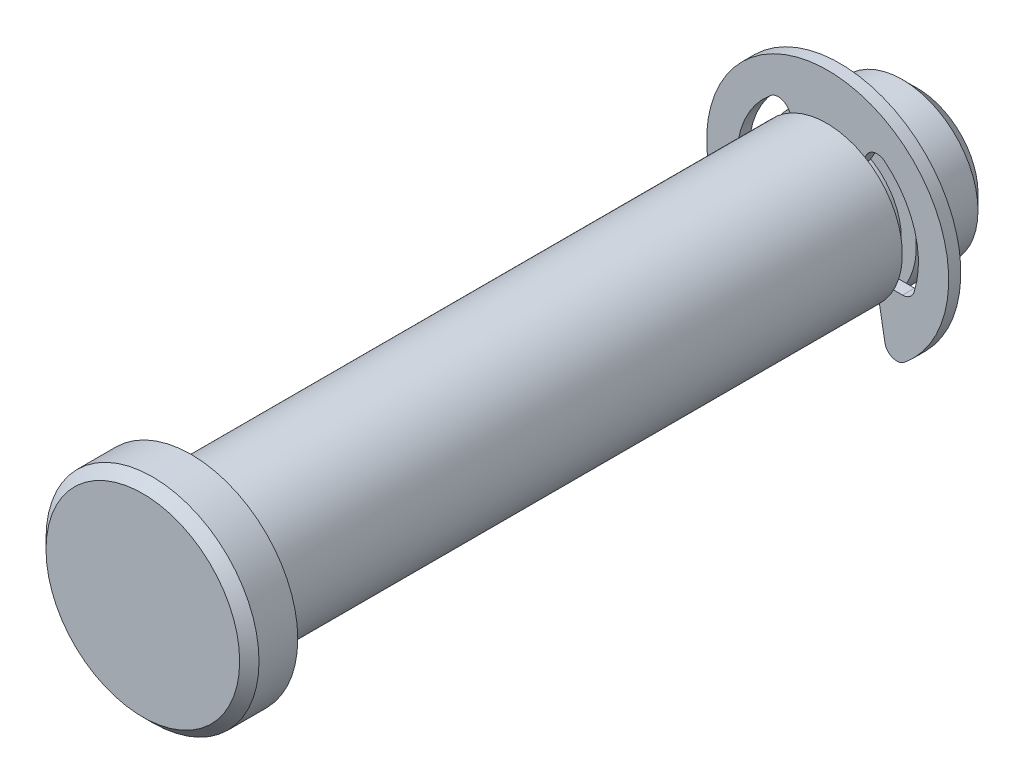
ISO-10303-21;
HEADER;
FILE_DESCRIPTION(('STEP AP214'),'2;1');
FILE_NAME('part.step','',(''),(''),'','','');
FILE_SCHEMA(('AUTOMOTIVE_DESIGN { 1 0 10303 214 1 1 1 1 }'));
ENDSEC;
DATA;
#1=APPLICATION_CONTEXT('core data for automotive mechanical design processes');
#2=APPLICATION_PROTOCOL_DEFINITION('international standard','automotive_design',2000,#1);
#3=PRODUCT_CONTEXT('',#1,'mechanical');
#4=PRODUCT('Part','Part','',(#3));
#5=PRODUCT_RELATED_PRODUCT_CATEGORY('part','',(#4));
#6=PRODUCT_DEFINITION_FORMATION('','',#4);
#7=PRODUCT_DEFINITION_CONTEXT('part definition',#1,'design');
#8=PRODUCT_DEFINITION('design','',#6,#7);
#9=PRODUCT_DEFINITION_SHAPE('','',#8);
#10=(LENGTH_UNIT() NAMED_UNIT(*) SI_UNIT(.MILLI.,.METRE.));
#11=(NAMED_UNIT(*) PLANE_ANGLE_UNIT() SI_UNIT($,.RADIAN.));
#12=(NAMED_UNIT(*) SI_UNIT($,.STERADIAN.) SOLID_ANGLE_UNIT());
#13=UNCERTAINTY_MEASURE_WITH_UNIT(LENGTH_MEASURE(1.E-05),#10,'distance_accuracy_value','');
#14=(GEOMETRIC_REPRESENTATION_CONTEXT(3) GLOBAL_UNCERTAINTY_ASSIGNED_CONTEXT((#13)) GLOBAL_UNIT_ASSIGNED_CONTEXT((#10,
#11,#12)) REPRESENTATION_CONTEXT('',''));
#15=CARTESIAN_POINT('',(0.,0.,0.));
#16=DIRECTION('',(0.,0.,1.));
#17=DIRECTION('',(1.,0.,0.));
#18=AXIS2_PLACEMENT_3D('',#15,#16,#17);
#19=CARTESIAN_POINT('',(0.,0.,-14.3383));
#20=DIRECTION('',(0.,0.,1.));
#21=DIRECTION('',(1.,0.,0.));
#22=AXIS2_PLACEMENT_3D('',#19,#20,#21);
#23=PLANE('',#22);
#24=DIRECTION('',(-0.173648177666931,0.984807753012208,0.));
#25=VECTOR('',#24,1.);
#26=CARTESIAN_POINT('',(2.1376354418804,0.376922803322178,-14.3383));
#27=LINE('',#26,#25);
#28=CARTESIAN_POINT('',(3.00221796143766,-4.52636832140214,-14.3383));
#29=VERTEX_POINT('',#28);
#30=CARTESIAN_POINT('',(2.54,-1.905,-14.3383));
#31=VERTEX_POINT('',#30);
#32=EDGE_CURVE('E199',#29,#31,#27,.T.);
#33=ORIENTED_EDGE('',*,*,#32,.F.);
#34=CARTESIAN_POINT('',(3.62757088460041,-4.41610172858364,-14.3383));
#35=DIRECTION('',(0.,0.,1.));
#36=DIRECTION('',(1.,0.,0.));
#37=AXIS2_PLACEMENT_3D('',#34,#35,#36);
#38=CIRCLE('',#37,0.635);
#39=CARTESIAN_POINT('',(4.03063431622268,-4.90677969842626,-14.3383));
#40=VERTEX_POINT('',#39);
#41=EDGE_CURVE('E253',#29,#40,#38,.T.);
#42=ORIENTED_EDGE('',*,*,#41,.T.);
#43=CARTESIAN_POINT('',(0.,0.,-14.3383));
#44=DIRECTION('',(0.,0.,1.));
#45=DIRECTION('',(1.,0.,0.));
#46=AXIS2_PLACEMENT_3D('',#43,#44,#45);
#47=CIRCLE('',#46,6.35);
#48=CARTESIAN_POINT('',(-4.03063431622268,-4.90677969842626,-14.3383));
#49=VERTEX_POINT('',#48);
#50=EDGE_CURVE('E179',#40,#49,#47,.T.);
#51=ORIENTED_EDGE('',*,*,#50,.T.);
#52=CARTESIAN_POINT('',(-3.62757088460041,-4.41610172858364,-14.3383));
#53=DIRECTION('',(0.,0.,1.));
#54=DIRECTION('',(1.,0.,0.));
#55=AXIS2_PLACEMENT_3D('',#52,#53,#54);
#56=CIRCLE('',#55,0.635);
#57=CARTESIAN_POINT('',(-3.00221796143766,-4.52636832140214,-14.3383));
#58=VERTEX_POINT('',#57);
#59=EDGE_CURVE('E251',#49,#58,#56,.T.);
#60=ORIENTED_EDGE('',*,*,#59,.T.);
#61=DIRECTION('',(-0.173648177666931,-0.984807753012208,0.));
#62=VECTOR('',#61,1.);
#63=CARTESIAN_POINT('',(-2.1376354418804,0.376922803322178,-14.3383));
#64=LINE('',#63,#62);
#65=CARTESIAN_POINT('',(-2.54,-1.905,-14.3383));
#66=VERTEX_POINT('',#65);
#67=EDGE_CURVE('E195',#66,#58,#64,.T.);
#68=ORIENTED_EDGE('',*,*,#67,.F.);
#69=DIRECTION('',(1.,0.,0.));
#70=VECTOR('',#69,1.);
#71=CARTESIAN_POINT('',(0.,-1.905,-14.3383));
#72=LINE('',#71,#70);
#73=CARTESIAN_POINT('',(-3.92725810840082,-1.905,-14.3383));
#74=VERTEX_POINT('',#73);
#75=EDGE_CURVE('E186',#74,#66,#72,.T.);
#76=ORIENTED_EDGE('',*,*,#75,.F.);
#77=CARTESIAN_POINT('',(-3.92725810840082,-1.27,-14.3383));
#78=DIRECTION('',(0.,0.,1.));
#79=DIRECTION('',(1.,0.,0.));
#80=AXIS2_PLACEMENT_3D('',#77,#78,#79);
#81=CIRCLE('',#80,0.635);
#82=CARTESIAN_POINT('',(-4.53145166353941,-1.46538461538462,-14.3383));
#83=VERTEX_POINT('',#82);
#84=EDGE_CURVE('E51',#74,#83,#81,.F.);
#85=ORIENTED_EDGE('',*,*,#84,.T.);
#86=CARTESIAN_POINT('',(0.,0.,-14.3383));
#87=DIRECTION('',(0.,0.,1.));
#88=DIRECTION('',(1.,0.,0.));
#89=AXIS2_PLACEMENT_3D('',#86,#87,#88);
#90=CIRCLE('',#89,4.7625);
#91=CARTESIAN_POINT('',(-2.98743092684563,3.70899753401458,-14.3383));
#92=VERTEX_POINT('',#91);
#93=EDGE_CURVE('E211',#92,#83,#90,.T.);
#94=ORIENTED_EDGE('',*,*,#93,.F.);
#95=CARTESIAN_POINT('',(-2.58910680326621,3.2144645294793,-14.3383));
#96=DIRECTION('',(0.,0.,1.));
#97=DIRECTION('',(1.,0.,0.));
#98=AXIS2_PLACEMENT_3D('',#95,#96,#97);
#99=CIRCLE('',#98,0.635);
#100=CARTESIAN_POINT('',(-2.0391806718631,3.53196452947931,-14.3383));
#101=VERTEX_POINT('',#100);
#102=EDGE_CURVE('E183',#92,#101,#99,.F.);
#103=ORIENTED_EDGE('',*,*,#102,.T.);
#104=DIRECTION('',(-0.500000000000002,0.866025403784438,0.));
#105=VECTOR('',#104,1.);
#106=CARTESIAN_POINT('',(0.,0.,-14.3383));
#107=LINE('',#106,#105);
#108=CARTESIAN_POINT('',(-1.5875,2.74963065701559,-14.3383));
#109=VERTEX_POINT('',#108);
#110=EDGE_CURVE('E175',#109,#101,#107,.T.);
#111=ORIENTED_EDGE('',*,*,#110,.F.);
#112=DIRECTION('',(1.,0.,0.));
#113=VECTOR('',#112,1.);
#114=CARTESIAN_POINT('',(-1.5875,2.74963065701559,-14.3383));
#115=LINE('',#114,#113);
#116=CARTESIAN_POINT('',(1.5875,2.74963065701559,-14.3383));
#117=VERTEX_POINT('',#116);
#118=EDGE_CURVE('E159',#109,#117,#115,.T.);
#119=ORIENTED_EDGE('',*,*,#118,.T.);
#120=DIRECTION('',(-0.500000000000002,-0.866025403784438,0.));
#121=VECTOR('',#120,1.);
#122=CARTESIAN_POINT('',(0.,0.,-14.3383));
#123=LINE('',#122,#121);
#124=CARTESIAN_POINT('',(2.0391806718631,3.53196452947931,-14.3383));
#125=VERTEX_POINT('',#124);
#126=EDGE_CURVE('E209',#125,#117,#123,.T.);
#127=ORIENTED_EDGE('',*,*,#126,.F.);
#128=CARTESIAN_POINT('',(2.58910680326621,3.2144645294793,-14.3383));
#129=DIRECTION('',(0.,0.,1.));
#130=DIRECTION('',(1.,0.,0.));
#131=AXIS2_PLACEMENT_3D('',#128,#129,#130);
#132=CIRCLE('',#131,0.635);
#133=CARTESIAN_POINT('',(2.98743092684563,3.70899753401458,-14.3383));
#134=VERTEX_POINT('',#133);
#135=EDGE_CURVE('E268',#125,#134,#132,.F.);
#136=ORIENTED_EDGE('',*,*,#135,.T.);
#137=CARTESIAN_POINT('',(0.,0.,-14.3383));
#138=DIRECTION('',(0.,0.,1.));
#139=DIRECTION('',(1.,0.,0.));
#140=AXIS2_PLACEMENT_3D('',#137,#138,#139);
#141=CIRCLE('',#140,4.7625);
#142=CARTESIAN_POINT('',(4.53145166353941,-1.46538461538462,-14.3383));
#143=VERTEX_POINT('',#142);
#144=EDGE_CURVE('E214',#143,#134,#141,.T.);
#145=ORIENTED_EDGE('',*,*,#144,.F.);
#146=CARTESIAN_POINT('',(3.92725810840082,-1.27,-14.3383));
#147=DIRECTION('',(0.,0.,1.));
#148=DIRECTION('',(1.,0.,0.));
#149=AXIS2_PLACEMENT_3D('',#146,#147,#148);
#150=CIRCLE('',#149,0.635);
#151=CARTESIAN_POINT('',(3.92725810840082,-1.905,-14.3383));
#152=VERTEX_POINT('',#151);
#153=EDGE_CURVE('E264',#143,#152,#150,.F.);
#154=ORIENTED_EDGE('',*,*,#153,.T.);
#155=DIRECTION('',(1.,0.,0.));
#156=VECTOR('',#155,1.);
#157=CARTESIAN_POINT('',(0.,-1.905,-14.3383));
#158=LINE('',#157,#156);
#159=EDGE_CURVE('E204',#31,#152,#158,.T.);
#160=ORIENTED_EDGE('',*,*,#159,.F.);
#161=EDGE_LOOP('',(#33,#42,#51,#60,#68,#76,#85,#94,#103,#111,#119,#127,#136,#145,#154,#160));
#162=FACE_BOUND('',#161,.T.);
#163=ADVANCED_FACE('F43',(#162),#23,.T.);
#164=CARTESIAN_POINT('',(0.,0.,-14.9733));
#165=DIRECTION('',(0.,0.,1.));
#166=DIRECTION('',(1.,0.,0.));
#167=AXIS2_PLACEMENT_3D('',#164,#165,#166);
#168=PLANE('',#167);
#169=CARTESIAN_POINT('',(0.,0.,-14.9733));
#170=DIRECTION('',(0.,0.,1.));
#171=DIRECTION('',(1.,0.,0.));
#172=AXIS2_PLACEMENT_3D('',#169,#170,#171);
#173=CIRCLE('',#172,6.35);
#174=CARTESIAN_POINT('',(4.03063431622268,-4.90677969842626,-14.9733));
#175=VERTEX_POINT('',#174);
#176=CARTESIAN_POINT('',(-4.03063431622268,-4.90677969842626,-14.9733));
#177=VERTEX_POINT('',#176);
#178=EDGE_CURVE('E217',#175,#177,#173,.T.);
#179=ORIENTED_EDGE('',*,*,#178,.F.);
#180=CARTESIAN_POINT('',(3.62757088460041,-4.41610172858364,-14.9733));
#181=DIRECTION('',(0.,0.,1.));
#182=DIRECTION('',(1.,0.,0.));
#183=AXIS2_PLACEMENT_3D('',#180,#181,#182);
#184=CIRCLE('',#183,0.635);
#185=CARTESIAN_POINT('',(3.00221796143766,-4.52636832140214,-14.9733));
#186=VERTEX_POINT('',#185);
#187=EDGE_CURVE('E261',#175,#186,#184,.F.);
#188=ORIENTED_EDGE('',*,*,#187,.T.);
#189=DIRECTION('',(-0.173648177666931,0.984807753012208,0.));
#190=VECTOR('',#189,1.);
#191=CARTESIAN_POINT('',(2.1376354418804,0.376922803322178,-14.9733));
#192=LINE('',#191,#190);
#193=CARTESIAN_POINT('',(2.54,-1.905,-14.9733));
#194=VERTEX_POINT('',#193);
#195=EDGE_CURVE('E197',#186,#194,#192,.T.);
#196=ORIENTED_EDGE('',*,*,#195,.T.);
#197=DIRECTION('',(1.,0.,0.));
#198=VECTOR('',#197,1.);
#199=CARTESIAN_POINT('',(0.,-1.905,-14.9733));
#200=LINE('',#199,#198);
#201=CARTESIAN_POINT('',(3.92725810840082,-1.905,-14.9733));
#202=VERTEX_POINT('',#201);
#203=EDGE_CURVE('E201',#194,#202,#200,.T.);
#204=ORIENTED_EDGE('',*,*,#203,.T.);
#205=CARTESIAN_POINT('',(3.92725810840082,-1.27,-14.9733));
#206=DIRECTION('',(0.,0.,1.));
#207=DIRECTION('',(1.,0.,0.));
#208=AXIS2_PLACEMENT_3D('',#205,#206,#207);
#209=CIRCLE('',#208,0.635);
#210=CARTESIAN_POINT('',(4.53145166353941,-1.46538461538462,-14.9733));
#211=VERTEX_POINT('',#210);
#212=EDGE_CURVE('E266',#202,#211,#209,.T.);
#213=ORIENTED_EDGE('',*,*,#212,.T.);
#214=CARTESIAN_POINT('',(0.,0.,-14.9733));
#215=DIRECTION('',(0.,0.,1.));
#216=DIRECTION('',(1.,0.,0.));
#217=AXIS2_PLACEMENT_3D('',#214,#215,#216);
#218=CIRCLE('',#217,4.7625);
#219=CARTESIAN_POINT('',(2.98743092684563,3.70899753401458,-14.9733));
#220=VERTEX_POINT('',#219);
#221=EDGE_CURVE('E225',#211,#220,#218,.T.);
#222=ORIENTED_EDGE('',*,*,#221,.T.);
#223=CARTESIAN_POINT('',(2.58910680326621,3.2144645294793,-14.9733));
#224=DIRECTION('',(0.,0.,1.));
#225=DIRECTION('',(1.,0.,0.));
#226=AXIS2_PLACEMENT_3D('',#223,#224,#225);
#227=CIRCLE('',#226,0.635);
#228=CARTESIAN_POINT('',(2.0391806718631,3.53196452947931,-14.9733));
#229=VERTEX_POINT('',#228);
#230=EDGE_CURVE('E270',#220,#229,#227,.T.);
#231=ORIENTED_EDGE('',*,*,#230,.T.);
#232=DIRECTION('',(-0.500000000000002,-0.866025403784438,0.));
#233=VECTOR('',#232,1.);
#234=CARTESIAN_POINT('',(0.,0.,-14.9733));
#235=LINE('',#234,#233);
#236=CARTESIAN_POINT('',(1.5875,2.74963065701559,-14.9733));
#237=VERTEX_POINT('',#236);
#238=EDGE_CURVE('E207',#229,#237,#235,.T.);
#239=ORIENTED_EDGE('',*,*,#238,.T.);
#240=DIRECTION('',(-1.,0.,0.));
#241=VECTOR('',#240,1.);
#242=CARTESIAN_POINT('',(-1.5875,2.74963065701559,-14.9733));
#243=LINE('',#242,#241);
#244=CARTESIAN_POINT('',(-1.5875,2.74963065701559,-14.9733));
#245=VERTEX_POINT('',#244);
#246=EDGE_CURVE('E170',#237,#245,#243,.T.);
#247=ORIENTED_EDGE('',*,*,#246,.T.);
#248=DIRECTION('',(-0.500000000000002,0.866025403784438,0.));
#249=VECTOR('',#248,1.);
#250=CARTESIAN_POINT('',(0.,0.,-14.9733));
#251=LINE('',#250,#249);
#252=CARTESIAN_POINT('',(-2.0391806718631,3.53196452947931,-14.9733));
#253=VERTEX_POINT('',#252);
#254=EDGE_CURVE('E178',#245,#253,#251,.T.);
#255=ORIENTED_EDGE('',*,*,#254,.T.);
#256=CARTESIAN_POINT('',(-2.58910680326621,3.2144645294793,-14.9733));
#257=DIRECTION('',(0.,0.,1.));
#258=DIRECTION('',(1.,0.,0.));
#259=AXIS2_PLACEMENT_3D('',#256,#257,#258);
#260=CIRCLE('',#259,0.635);
#261=CARTESIAN_POINT('',(-2.98743092684563,3.70899753401458,-14.9733));
#262=VERTEX_POINT('',#261);
#263=EDGE_CURVE('E273',#253,#262,#260,.T.);
#264=ORIENTED_EDGE('',*,*,#263,.T.);
#265=CARTESIAN_POINT('',(0.,0.,-14.9733));
#266=DIRECTION('',(0.,0.,1.));
#267=DIRECTION('',(1.,0.,0.));
#268=AXIS2_PLACEMENT_3D('',#265,#266,#267);
#269=CIRCLE('',#268,4.7625);
#270=CARTESIAN_POINT('',(-4.53145166353941,-1.46538461538462,-14.9733));
#271=VERTEX_POINT('',#270);
#272=EDGE_CURVE('E222',#262,#271,#269,.T.);
#273=ORIENTED_EDGE('',*,*,#272,.T.);
#274=CARTESIAN_POINT('',(-3.92725810840082,-1.27,-14.9733));
#275=DIRECTION('',(0.,0.,1.));
#276=DIRECTION('',(1.,0.,0.));
#277=AXIS2_PLACEMENT_3D('',#274,#275,#276);
#278=CIRCLE('',#277,0.635);
#279=CARTESIAN_POINT('',(-3.92725810840082,-1.905,-14.9733));
#280=VERTEX_POINT('',#279);
#281=EDGE_CURVE('E12',#271,#280,#278,.T.);
#282=ORIENTED_EDGE('',*,*,#281,.T.);
#283=DIRECTION('',(1.,0.,0.));
#284=VECTOR('',#283,1.);
#285=CARTESIAN_POINT('',(0.,-1.905,-14.9733));
#286=LINE('',#285,#284);
#287=CARTESIAN_POINT('',(-2.54,-1.905,-14.9733));
#288=VERTEX_POINT('',#287);
#289=EDGE_CURVE('E184',#280,#288,#286,.T.);
#290=ORIENTED_EDGE('',*,*,#289,.T.);
#291=DIRECTION('',(-0.173648177666931,-0.984807753012208,0.));
#292=VECTOR('',#291,1.);
#293=CARTESIAN_POINT('',(-2.1376354418804,0.376922803322178,-14.9733));
#294=LINE('',#293,#292);
#295=CARTESIAN_POINT('',(-3.00221796143766,-4.52636832140214,-14.9733));
#296=VERTEX_POINT('',#295);
#297=EDGE_CURVE('E193',#288,#296,#294,.T.);
#298=ORIENTED_EDGE('',*,*,#297,.T.);
#299=CARTESIAN_POINT('',(-3.62757088460041,-4.41610172858364,-14.9733));
#300=DIRECTION('',(0.,0.,1.));
#301=DIRECTION('',(1.,0.,0.));
#302=AXIS2_PLACEMENT_3D('',#299,#300,#301);
#303=CIRCLE('',#302,0.635);
#304=EDGE_CURVE('E65',#296,#177,#303,.F.);
#305=ORIENTED_EDGE('',*,*,#304,.T.);
#306=EDGE_LOOP('',(#179,#188,#196,#204,#213,#222,#231,#239,#247,#255,#264,#273,#282,#290,#298,#305));
#307=FACE_BOUND('',#306,.T.);
#308=ADVANCED_FACE('F286',(#307),#168,.F.);
#309=CARTESIAN_POINT('',(0.,0.,-14.3383));
#310=DIRECTION('',(0.,0.,-1.));
#311=DIRECTION('',(-1.,0.,0.));
#312=AXIS2_PLACEMENT_3D('',#309,#310,#311);
#313=CYLINDRICAL_SURFACE('',#312,6.35);
#314=ORIENTED_EDGE('',*,*,#50,.F.);
#315=DIRECTION('',(0.,0.,-1.));
#316=VECTOR('',#315,1.);
#317=CARTESIAN_POINT('',(4.03063431622268,-4.90677969842627,-14.3383));
#318=LINE('',#317,#316);
#319=EDGE_CURVE('E258',#40,#175,#318,.T.);
#320=ORIENTED_EDGE('',*,*,#319,.T.);
#321=ORIENTED_EDGE('',*,*,#178,.T.);
#322=DIRECTION('',(0.,0.,-1.));
#323=VECTOR('',#322,1.);
#324=CARTESIAN_POINT('',(-4.03063431622268,-4.90677969842627,-14.3383));
#325=LINE('',#324,#323);
#326=EDGE_CURVE('E255',#177,#49,#325,.F.);
#327=ORIENTED_EDGE('',*,*,#326,.T.);
#328=EDGE_LOOP('',(#314,#320,#321,#327));
#329=FACE_BOUND('',#328,.T.);
#330=ADVANCED_FACE('F326',(#329),#313,.T.);
#331=CARTESIAN_POINT('',(-2.54,-1.905,-19.05));
#332=DIRECTION('',(-0.984807753012208,0.173648177666931,0.));
#333=DIRECTION('',(-0.173648177666931,-0.984807753012208,0.));
#334=AXIS2_PLACEMENT_3D('',#331,#332,#333);
#335=PLANE('',#334);
#336=ORIENTED_EDGE('',*,*,#67,.T.);
#337=DIRECTION('',(0.,0.,-1.));
#338=VECTOR('',#337,1.);
#339=CARTESIAN_POINT('',(-3.00221796143766,-4.52636832140214,-19.05));
#340=LINE('',#339,#338);
#341=EDGE_CURVE('E58',#58,#296,#340,.T.);
#342=ORIENTED_EDGE('',*,*,#341,.T.);
#343=ORIENTED_EDGE('',*,*,#297,.F.);
#344=DIRECTION('',(0.,0.,1.));
#345=VECTOR('',#344,1.);
#346=CARTESIAN_POINT('',(-2.54,-1.905,-19.05));
#347=LINE('',#346,#345);
#348=EDGE_CURVE('E291',#288,#66,#347,.T.);
#349=ORIENTED_EDGE('',*,*,#348,.T.);
#350=EDGE_LOOP('',(#336,#342,#343,#349));
#351=FACE_BOUND('',#350,.T.);
#352=ADVANCED_FACE('F331',(#351),#335,.F.);
#353=CARTESIAN_POINT('',(-2.38125000000001,4.12444598552338,-19.05));
#354=DIRECTION('',(0.866025403784438,0.500000000000001,0.));
#355=DIRECTION('',(-0.500000000000002,0.866025403784438,0.));
#356=AXIS2_PLACEMENT_3D('',#353,#354,#355);
#357=PLANE('',#356);
#358=ORIENTED_EDGE('',*,*,#110,.T.);
#359=DIRECTION('',(0.,0.,-1.));
#360=VECTOR('',#359,1.);
#361=CARTESIAN_POINT('',(-2.03918067186309,3.5319645294793,-14.9733));
#362=LINE('',#361,#360);
#363=EDGE_CURVE('E243',#101,#253,#362,.T.);
#364=ORIENTED_EDGE('',*,*,#363,.T.);
#365=ORIENTED_EDGE('',*,*,#254,.F.);
#366=DIRECTION('',(0.,0.,-1.));
#367=VECTOR('',#366,1.);
#368=CARTESIAN_POINT('',(-1.5875,2.74963065701559,-14.3383));
#369=LINE('',#368,#367);
#370=EDGE_CURVE('E163',#245,#109,#369,.F.);
#371=ORIENTED_EDGE('',*,*,#370,.T.);
#372=EDGE_LOOP('',(#358,#364,#365,#371));
#373=FACE_BOUND('',#372,.T.);
#374=ADVANCED_FACE('F174',(#373),#357,.F.);
#375=CARTESIAN_POINT('',(0.,0.,-19.05));
#376=DIRECTION('',(0.,0.,1.));
#377=DIRECTION('',(1.,0.,0.));
#378=AXIS2_PLACEMENT_3D('',#375,#376,#377);
#379=CYLINDRICAL_SURFACE('',#378,4.7625);
#380=ORIENTED_EDGE('',*,*,#272,.F.);
#381=DIRECTION('',(0.,0.,1.));
#382=VECTOR('',#381,1.);
#383=CARTESIAN_POINT('',(-2.98743092684563,3.70899753401458,-19.05));
#384=LINE('',#383,#382);
#385=EDGE_CURVE('E240',#262,#92,#384,.T.);
#386=ORIENTED_EDGE('',*,*,#385,.T.);
#387=ORIENTED_EDGE('',*,*,#93,.T.);
#388=DIRECTION('',(0.,0.,1.));
#389=VECTOR('',#388,1.);
#390=CARTESIAN_POINT('',(-4.53145166353941,-1.46538461538461,-19.05));
#391=LINE('',#390,#389);
#392=EDGE_CURVE('E238',#83,#271,#391,.F.);
#393=ORIENTED_EDGE('',*,*,#392,.T.);
#394=EDGE_LOOP('',(#380,#386,#387,#393));
#395=FACE_BOUND('',#394,.T.);
#396=ADVANCED_FACE('F281',(#395),#379,.F.);
#397=CARTESIAN_POINT('',(-4.36490334944544,-1.905,-19.05));
#398=DIRECTION('',(0.,-1.,0.));
#399=DIRECTION('',(0.,0.,-1.));
#400=AXIS2_PLACEMENT_3D('',#397,#398,#399);
#401=PLANE('',#400);
#402=ORIENTED_EDGE('',*,*,#289,.F.);
#403=DIRECTION('',(0.,0.,-1.));
#404=VECTOR('',#403,1.);
#405=CARTESIAN_POINT('',(-3.92725810840082,-1.905,-14.3383));
#406=LINE('',#405,#404);
#407=EDGE_CURVE('E245',#280,#74,#406,.F.);
#408=ORIENTED_EDGE('',*,*,#407,.T.);
#409=ORIENTED_EDGE('',*,*,#75,.T.);
#410=ORIENTED_EDGE('',*,*,#348,.F.);
#411=EDGE_LOOP('',(#402,#408,#409,#410));
#412=FACE_BOUND('',#411,.T.);
#413=ADVANCED_FACE('F289',(#412),#401,.F.);
#414=CARTESIAN_POINT('',(0.,0.,-19.05));
#415=DIRECTION('',(0.,0.,1.));
#416=DIRECTION('',(1.,0.,0.));
#417=AXIS2_PLACEMENT_3D('',#414,#415,#416);
#418=CYLINDRICAL_SURFACE('',#417,4.7625);
#419=ORIENTED_EDGE('',*,*,#221,.F.);
#420=DIRECTION('',(0.,0.,1.));
#421=VECTOR('',#420,1.);
#422=CARTESIAN_POINT('',(4.53145166353941,-1.46538461538461,-19.05));
#423=LINE('',#422,#421);
#424=EDGE_CURVE('E230',#211,#143,#423,.T.);
#425=ORIENTED_EDGE('',*,*,#424,.T.);
#426=ORIENTED_EDGE('',*,*,#144,.T.);
#427=DIRECTION('',(0.,0.,1.));
#428=VECTOR('',#427,1.);
#429=CARTESIAN_POINT('',(2.98743092684563,3.70899753401458,-19.05));
#430=LINE('',#429,#428);
#431=EDGE_CURVE('E228',#134,#220,#430,.F.);
#432=ORIENTED_EDGE('',*,*,#431,.T.);
#433=EDGE_LOOP('',(#419,#425,#426,#432));
#434=FACE_BOUND('',#433,.T.);
#435=ADVANCED_FACE('F305',(#434),#418,.F.);
#436=CARTESIAN_POINT('',(2.54,-1.905,-19.05));
#437=DIRECTION('',(0.,-1.,0.));
#438=DIRECTION('',(0.,0.,-1.));
#439=AXIS2_PLACEMENT_3D('',#436,#437,#438);
#440=PLANE('',#439);
#441=ORIENTED_EDGE('',*,*,#159,.T.);
#442=DIRECTION('',(0.,0.,-1.));
#443=VECTOR('',#442,1.);
#444=CARTESIAN_POINT('',(3.92725810840082,-1.905,-14.9733));
#445=LINE('',#444,#443);
#446=EDGE_CURVE('E233',#152,#202,#445,.T.);
#447=ORIENTED_EDGE('',*,*,#446,.T.);
#448=ORIENTED_EDGE('',*,*,#203,.F.);
#449=DIRECTION('',(0.,0.,1.));
#450=VECTOR('',#449,1.);
#451=CARTESIAN_POINT('',(2.54,-1.905,-19.05));
#452=LINE('',#451,#450);
#453=EDGE_CURVE('E188',#194,#31,#452,.T.);
#454=ORIENTED_EDGE('',*,*,#453,.T.);
#455=EDGE_LOOP('',(#441,#447,#448,#454));
#456=FACE_BOUND('',#455,.T.);
#457=ADVANCED_FACE('F315',(#456),#440,.F.);
#458=CARTESIAN_POINT('',(2.54,-1.905,-19.05));
#459=DIRECTION('',(0.984807753012208,0.173648177666931,0.));
#460=DIRECTION('',(-0.173648177666931,0.984807753012208,0.));
#461=AXIS2_PLACEMENT_3D('',#458,#459,#460);
#462=PLANE('',#461);
#463=ORIENTED_EDGE('',*,*,#195,.F.);
#464=DIRECTION('',(0.,0.,-1.));
#465=VECTOR('',#464,1.);
#466=CARTESIAN_POINT('',(3.00221796143766,-4.52636832140214,-19.05));
#467=LINE('',#466,#465);
#468=EDGE_CURVE('E248',#186,#29,#467,.F.);
#469=ORIENTED_EDGE('',*,*,#468,.T.);
#470=ORIENTED_EDGE('',*,*,#32,.T.);
#471=ORIENTED_EDGE('',*,*,#453,.F.);
#472=EDGE_LOOP('',(#463,#469,#470,#471));
#473=FACE_BOUND('',#472,.T.);
#474=ADVANCED_FACE('F320',(#473),#462,.F.);
#475=CARTESIAN_POINT('',(0.,0.,-19.05));
#476=DIRECTION('',(-0.866025403784438,0.500000000000001,0.));
#477=DIRECTION('',(-0.500000000000002,-0.866025403784438,0.));
#478=AXIS2_PLACEMENT_3D('',#475,#476,#477);
#479=PLANE('',#478);
#480=ORIENTED_EDGE('',*,*,#238,.F.);
#481=DIRECTION('',(0.,0.,-1.));
#482=VECTOR('',#481,1.);
#483=CARTESIAN_POINT('',(2.03918067186309,3.5319645294793,-14.3383));
#484=LINE('',#483,#482);
#485=EDGE_CURVE('E235',#229,#125,#484,.F.);
#486=ORIENTED_EDGE('',*,*,#485,.T.);
#487=ORIENTED_EDGE('',*,*,#126,.T.);
#488=DIRECTION('',(0.,0.,-1.));
#489=VECTOR('',#488,1.);
#490=CARTESIAN_POINT('',(1.5875,2.74963065701559,-14.3383));
#491=LINE('',#490,#489);
#492=EDGE_CURVE('E166',#117,#237,#491,.T.);
#493=ORIENTED_EDGE('',*,*,#492,.T.);
#494=EDGE_LOOP('',(#480,#486,#487,#493));
#495=FACE_BOUND('',#494,.T.);
#496=ADVANCED_FACE('F298',(#495),#479,.F.);
#497=CARTESIAN_POINT('',(-1.5875,2.74963065701559,-18.1766676151749));
#498=DIRECTION('',(0.,-1.,0.));
#499=DIRECTION('',(0.,0.,-1.));
#500=AXIS2_PLACEMENT_3D('',#497,#498,#499);
#501=PLANE('',#500);
#502=ORIENTED_EDGE('',*,*,#246,.F.);
#503=ORIENTED_EDGE('',*,*,#492,.F.);
#504=ORIENTED_EDGE('',*,*,#118,.F.);
#505=ORIENTED_EDGE('',*,*,#370,.F.);
#506=EDGE_LOOP('',(#502,#503,#504,#505));
#507=FACE_BOUND('',#506,.T.);
#508=ADVANCED_FACE('F162',(#507),#501,.T.);
#509=CARTESIAN_POINT('',(3.92725810840082,-1.27,-19.05));
#510=DIRECTION('',(0.,0.,1.));
#511=DIRECTION('',(1.,0.,0.));
#512=AXIS2_PLACEMENT_3D('',#509,#510,#511);
#513=CYLINDRICAL_SURFACE('',#512,0.635);
#514=ORIENTED_EDGE('',*,*,#212,.F.);
#515=ORIENTED_EDGE('',*,*,#446,.F.);
#516=ORIENTED_EDGE('',*,*,#153,.F.);
#517=ORIENTED_EDGE('',*,*,#424,.F.);
#518=EDGE_LOOP('',(#514,#515,#516,#517));
#519=FACE_BOUND('',#518,.T.);
#520=ADVANCED_FACE('F311',(#519),#513,.F.);
#521=CARTESIAN_POINT('',(2.58910680326621,3.2144645294793,-19.05));
#522=DIRECTION('',(0.,0.,1.));
#523=DIRECTION('',(1.,0.,0.));
#524=AXIS2_PLACEMENT_3D('',#521,#522,#523);
#525=CYLINDRICAL_SURFACE('',#524,0.635);
#526=ORIENTED_EDGE('',*,*,#230,.F.);
#527=ORIENTED_EDGE('',*,*,#431,.F.);
#528=ORIENTED_EDGE('',*,*,#135,.F.);
#529=ORIENTED_EDGE('',*,*,#485,.F.);
#530=EDGE_LOOP('',(#526,#527,#528,#529));
#531=FACE_BOUND('',#530,.T.);
#532=ADVANCED_FACE('F308',(#531),#525,.F.);
#533=CARTESIAN_POINT('',(-2.58910680326621,3.2144645294793,-19.05));
#534=DIRECTION('',(0.,0.,1.));
#535=DIRECTION('',(1.,0.,0.));
#536=AXIS2_PLACEMENT_3D('',#533,#534,#535);
#537=CYLINDRICAL_SURFACE('',#536,0.635);
#538=ORIENTED_EDGE('',*,*,#263,.F.);
#539=ORIENTED_EDGE('',*,*,#363,.F.);
#540=ORIENTED_EDGE('',*,*,#102,.F.);
#541=ORIENTED_EDGE('',*,*,#385,.F.);
#542=EDGE_LOOP('',(#538,#539,#540,#541));
#543=FACE_BOUND('',#542,.T.);
#544=ADVANCED_FACE('F354',(#543),#537,.F.);
#545=CARTESIAN_POINT('',(-3.92725810840082,-1.27,-19.05));
#546=DIRECTION('',(0.,0.,1.));
#547=DIRECTION('',(1.,0.,0.));
#548=AXIS2_PLACEMENT_3D('',#545,#546,#547);
#549=CYLINDRICAL_SURFACE('',#548,0.635);
#550=ORIENTED_EDGE('',*,*,#281,.F.);
#551=ORIENTED_EDGE('',*,*,#392,.F.);
#552=ORIENTED_EDGE('',*,*,#84,.F.);
#553=ORIENTED_EDGE('',*,*,#407,.F.);
#554=EDGE_LOOP('',(#550,#551,#552,#553));
#555=FACE_BOUND('',#554,.T.);
#556=ADVANCED_FACE('F284',(#555),#549,.F.);
#557=CARTESIAN_POINT('',(3.62757088460041,-4.41610172858364,-14.3383));
#558=DIRECTION('',(0.,0.,-1.));
#559=DIRECTION('',(-1.,0.,0.));
#560=AXIS2_PLACEMENT_3D('',#557,#558,#559);
#561=CYLINDRICAL_SURFACE('',#560,0.635);
#562=ORIENTED_EDGE('',*,*,#187,.F.);
#563=ORIENTED_EDGE('',*,*,#319,.F.);
#564=ORIENTED_EDGE('',*,*,#41,.F.);
#565=ORIENTED_EDGE('',*,*,#468,.F.);
#566=EDGE_LOOP('',(#562,#563,#564,#565));
#567=FACE_BOUND('',#566,.T.);
#568=ADVANCED_FACE('F329',(#567),#561,.T.);
#569=CARTESIAN_POINT('',(-3.62757088460041,-4.41610172858364,-14.3383));
#570=DIRECTION('',(0.,0.,-1.));
#571=DIRECTION('',(-1.,0.,0.));
#572=AXIS2_PLACEMENT_3D('',#569,#570,#571);
#573=CYLINDRICAL_SURFACE('',#572,0.635);
#574=ORIENTED_EDGE('',*,*,#304,.F.);
#575=ORIENTED_EDGE('',*,*,#341,.F.);
#576=ORIENTED_EDGE('',*,*,#59,.F.);
#577=ORIENTED_EDGE('',*,*,#326,.F.);
#578=EDGE_LOOP('',(#574,#575,#576,#577));
#579=FACE_BOUND('',#578,.T.);
#580=ADVANCED_FACE('F45',(#579),#573,.T.);
#581=CLOSED_SHELL('',(#163,#308,#330,#352,#374,#396,#413,#435,#457,#474,#496,#508,#520,#532,
#544,#556,#568,#580));
#582=MANIFOLD_SOLID_BREP('B2',#581);
#583=CARTESIAN_POINT('',(0.,0.,19.05));
#584=DIRECTION('',(0.,0.,-1.));
#585=DIRECTION('',(-1.,0.,0.));
#586=AXIS2_PLACEMENT_3D('',#583,#584,#585);
#587=CYLINDRICAL_SURFACE('',#586,3.96875);
#588=CARTESIAN_POINT('',(0.,0.,19.05));
#589=DIRECTION('',(0.,0.,1.));
#590=DIRECTION('',(1.,0.,0.));
#591=AXIS2_PLACEMENT_3D('',#588,#589,#590);
#592=CIRCLE('',#591,3.96875);
#593=CARTESIAN_POINT('',(-3.96875,0.,19.05));
#594=VERTEX_POINT('',#593);
#595=EDGE_CURVE('E506',#594,#594,#592,.T.);
#596=CARTESIAN_POINT('',(0.,0.,-14.2875));
#597=DIRECTION('',(0.,0.,1.));
#598=DIRECTION('',(1.,0.,0.));
#599=AXIS2_PLACEMENT_3D('',#596,#597,#598);
#600=CIRCLE('',#599,3.96875);
#601=CARTESIAN_POINT('',(-3.96875,0.,-14.2875));
#602=VERTEX_POINT('',#601);
#603=EDGE_CURVE('E518',#602,#602,#600,.T.);
#604=CARTESIAN_POINT('',(-3.96875,0.,19.05));
#605=CARTESIAN_POINT('',(-3.96875,0.,18.702734375));
#606=CARTESIAN_POINT('',(-3.96875,0.,18.35546875));
#607=CARTESIAN_POINT('',(-3.96875,0.,17.6609375));
#608=CARTESIAN_POINT('',(-3.96875,0.,17.313671875));
#609=CARTESIAN_POINT('',(-3.96875,0.,16.619140625));
#610=CARTESIAN_POINT('',(-3.96875,0.,16.271875));
#611=CARTESIAN_POINT('',(-3.96875,0.,15.57734375));
#612=CARTESIAN_POINT('',(-3.96875,0.,15.230078125));
#613=CARTESIAN_POINT('',(-3.96875,0.,14.535546875));
#614=CARTESIAN_POINT('',(-3.96875,0.,14.18828125));
#615=CARTESIAN_POINT('',(-3.96875,0.,13.49375));
#616=CARTESIAN_POINT('',(-3.96875,0.,13.146484375));
#617=CARTESIAN_POINT('',(-3.96875,0.,12.451953125));
#618=CARTESIAN_POINT('',(-3.96875,0.,12.1046875));
#619=CARTESIAN_POINT('',(-3.96875,0.,11.41015625));
#620=CARTESIAN_POINT('',(-3.96875,0.,11.062890625));
#621=CARTESIAN_POINT('',(-3.96875,0.,10.368359375));
#622=CARTESIAN_POINT('',(-3.96875,0.,10.02109375));
#623=CARTESIAN_POINT('',(-3.96875,0.,9.3265625));
#624=CARTESIAN_POINT('',(-3.96875,0.,8.979296875));
#625=CARTESIAN_POINT('',(-3.96875,0.,8.284765625));
#626=CARTESIAN_POINT('',(-3.96875,0.,7.9375));
#627=CARTESIAN_POINT('',(-3.96875,0.,7.24296875));
#628=CARTESIAN_POINT('',(-3.96875,0.,6.895703125));
#629=CARTESIAN_POINT('',(-3.96875,0.,6.201171875));
#630=CARTESIAN_POINT('',(-3.96875,0.,5.85390625));
#631=CARTESIAN_POINT('',(-3.96875,0.,5.159375));
#632=CARTESIAN_POINT('',(-3.96875,0.,4.812109375));
#633=CARTESIAN_POINT('',(-3.96875,0.,4.117578125));
#634=CARTESIAN_POINT('',(-3.96875,0.,3.7703125));
#635=CARTESIAN_POINT('',(-3.96875,0.,3.07578125));
#636=CARTESIAN_POINT('',(-3.96875,0.,2.728515625));
#637=CARTESIAN_POINT('',(-3.96875,0.,2.033984375));
#638=CARTESIAN_POINT('',(-3.96875,0.,1.68671875));
#639=CARTESIAN_POINT('',(-3.96875,0.,0.992187499999997));
#640=CARTESIAN_POINT('',(-3.96875,0.,0.644921874999997));
#641=CARTESIAN_POINT('',(-3.96875,0.,-0.0496093750000035));
#642=CARTESIAN_POINT('',(-3.96875,0.,-0.396875000000004));
#643=CARTESIAN_POINT('',(-3.96875,0.,-1.09140625));
#644=CARTESIAN_POINT('',(-3.96875,0.,-1.438671875));
#645=CARTESIAN_POINT('',(-3.96875,0.,-2.133203125));
#646=CARTESIAN_POINT('',(-3.96875,0.,-2.48046875));
#647=CARTESIAN_POINT('',(-3.96875,0.,-3.175));
#648=CARTESIAN_POINT('',(-3.96875,0.,-3.522265625));
#649=CARTESIAN_POINT('',(-3.96875,0.,-4.216796875));
#650=CARTESIAN_POINT('',(-3.96875,0.,-4.5640625));
#651=CARTESIAN_POINT('',(-3.96875,0.,-5.25859375));
#652=CARTESIAN_POINT('',(-3.96875,0.,-5.605859375));
#653=CARTESIAN_POINT('',(-3.96875,0.,-6.300390625));
#654=CARTESIAN_POINT('',(-3.96875,0.,-6.64765625));
#655=CARTESIAN_POINT('',(-3.96875,0.,-7.3421875));
#656=CARTESIAN_POINT('',(-3.96875,0.,-7.689453125));
#657=CARTESIAN_POINT('',(-3.96875,0.,-8.38398437500001));
#658=CARTESIAN_POINT('',(-3.96875,0.,-8.73125));
#659=CARTESIAN_POINT('',(-3.96875,0.,-9.42578125000001));
#660=CARTESIAN_POINT('',(-3.96875,0.,-9.773046875));
#661=CARTESIAN_POINT('',(-3.96875,0.,-10.467578125));
#662=CARTESIAN_POINT('',(-3.96875,0.,-10.81484375));
#663=CARTESIAN_POINT('',(-3.96875,0.,-11.509375));
#664=CARTESIAN_POINT('',(-3.96875,0.,-11.856640625));
#665=CARTESIAN_POINT('',(-3.96875,0.,-12.551171875));
#666=CARTESIAN_POINT('',(-3.96875,0.,-12.8984375));
#667=CARTESIAN_POINT('',(-3.96875,0.,-13.59296875));
#668=CARTESIAN_POINT('',(-3.96875,0.,-13.940234375));
#669=CARTESIAN_POINT('',(-3.96875,0.,-14.2875));
#670=B_SPLINE_CURVE_WITH_KNOTS('',3,(#604,#605,#606,#607,#608,#609,#610,#611,#612,#613,#614,
#615,#616,#617,#618,#619,#620,#621,#622,#623,#624,#625,#626,#627,#628,#629,#630,#631,#632,#633,
#634,#635,#636,#637,#638,#639,#640,#641,#642,#643,#644,#645,#646,#647,#648,#649,#650,#651,#652,
#653,#654,#655,#656,#657,#658,#659,#660,#661,#662,#663,#664,#665,#666,#667,#668,#669),
.UNSPECIFIED.,.F.,.F.,(4,2,2,2,2,2,2,2,2,2,2,2,2,2,2,2,2,2,2,2,2,2,2,2,2,2,2,2,2,2,2,2,4),(0.,
1.041796875,2.08359375,3.125390625,4.1671875,5.208984375,6.25078125,7.292578125,8.334375,
9.376171875,10.41796875,11.459765625,12.5015625,13.543359375,14.58515625,15.626953125,16.66875,
17.710546875,18.75234375,19.794140625,20.8359375,21.877734375,22.91953125,23.961328125,
25.003125,26.044921875,27.08671875,28.128515625,29.1703125,30.212109375,31.25390625,
32.295703125,33.3375),.UNSPECIFIED.);
#671=EDGE_CURVE('BSEAM486',#594,#602,#670,.T.);
#672=ORIENTED_EDGE('',*,*,#595,.F.);
#673=ORIENTED_EDGE('',*,*,#603,.T.);
#674=ORIENTED_EDGE('',*,*,#671,.T.);
#675=ORIENTED_EDGE('',*,*,#671,.F.);
#676=EDGE_LOOP('',(#672,#674,#673,#675));
#677=FACE_BOUND('',#676,.T.);
#678=ADVANCED_FACE('F486',(#677),#587,.T.);
#679=CARTESIAN_POINT('',(0.,3.96875,-14.2875));
#680=DIRECTION('',(0.,0.,-1.));
#681=DIRECTION('',(-1.,0.,0.));
#682=AXIS2_PLACEMENT_3D('',#679,#680,#681);
#683=PLANE('',#682);
#684=CARTESIAN_POINT('',(0.,0.,-14.2875));
#685=DIRECTION('',(0.,0.,1.));
#686=DIRECTION('',(1.,0.,0.));
#687=AXIS2_PLACEMENT_3D('',#684,#685,#686);
#688=CIRCLE('',#687,3.175);
#689=CARTESIAN_POINT('',(3.175,0.,-14.2875));
#690=VERTEX_POINT('',#689);
#691=EDGE_CURVE('E509',#690,#690,#688,.T.);
#692=ORIENTED_EDGE('',*,*,#691,.T.);
#693=EDGE_LOOP('',(#692));
#694=FACE_BOUND('',#693,.T.);
#695=ORIENTED_EDGE('',*,*,#603,.F.);
#696=EDGE_LOOP('',(#695));
#697=FACE_BOUND('',#696,.T.);
#698=ADVANCED_FACE('F536',(#694,#697),#683,.T.);
#699=CARTESIAN_POINT('',(0.,0.,19.05));
#700=DIRECTION('',(0.,0.,1.));
#701=DIRECTION('',(1.,0.,0.));
#702=AXIS2_PLACEMENT_3D('',#699,#700,#701);
#703=CYLINDRICAL_SURFACE('',#702,3.175);
#704=CARTESIAN_POINT('',(0.,0.,-15.0241));
#705=DIRECTION('',(0.,0.,1.));
#706=DIRECTION('',(1.,0.,0.));
#707=AXIS2_PLACEMENT_3D('',#704,#705,#706);
#708=CIRCLE('',#707,3.175);
#709=CARTESIAN_POINT('',(3.175,0.,-15.0241));
#710=VERTEX_POINT('',#709);
#711=EDGE_CURVE('E512',#710,#710,#708,.T.);
#712=ORIENTED_EDGE('',*,*,#711,.T.);
#713=EDGE_LOOP('',(#712));
#714=FACE_BOUND('',#713,.T.);
#715=ORIENTED_EDGE('',*,*,#691,.F.);
#716=EDGE_LOOP('',(#715));
#717=FACE_BOUND('',#716,.T.);
#718=ADVANCED_FACE('F541',(#714,#717),#703,.T.);
#719=CARTESIAN_POINT('',(0.,3.96875,-15.0241));
#720=DIRECTION('',(0.,0.,1.));
#721=DIRECTION('',(1.,0.,0.));
#722=AXIS2_PLACEMENT_3D('',#719,#720,#721);
#723=PLANE('',#722);
#724=CARTESIAN_POINT('',(0.,0.,-15.0241));
#725=DIRECTION('',(0.,0.,1.));
#726=DIRECTION('',(1.,0.,0.));
#727=AXIS2_PLACEMENT_3D('',#724,#725,#726);
#728=CIRCLE('',#727,3.96875);
#729=CARTESIAN_POINT('',(-3.96875,0.,-15.0241));
#730=VERTEX_POINT('',#729);
#731=EDGE_CURVE('E515',#730,#730,#728,.T.);
#732=ORIENTED_EDGE('',*,*,#731,.T.);
#733=EDGE_LOOP('',(#732));
#734=FACE_BOUND('',#733,.T.);
#735=ORIENTED_EDGE('',*,*,#711,.F.);
#736=EDGE_LOOP('',(#735));
#737=FACE_BOUND('',#736,.T.);
#738=ADVANCED_FACE('F547',(#734,#737),#723,.T.);
#739=CARTESIAN_POINT('',(0.,0.,-19.05));
#740=DIRECTION('',(0.,0.,1.));
#741=DIRECTION('',(1.,0.,0.));
#742=AXIS2_PLACEMENT_3D('',#739,#740,#741);
#743=PLANE('',#742);
#744=CARTESIAN_POINT('',(0.,0.,-19.05));
#745=DIRECTION('',(0.,0.,1.));
#746=DIRECTION('',(1.,0.,0.));
#747=AXIS2_PLACEMENT_3D('',#744,#745,#746);
#748=CIRCLE('',#747,3.17499999999996);
#749=CARTESIAN_POINT('',(3.17499999999996,0.,-19.05));
#750=VERTEX_POINT('',#749);
#751=EDGE_CURVE('E42',#750,#750,#748,.F.);
#752=ORIENTED_EDGE('',*,*,#751,.T.);
#753=EDGE_LOOP('',(#752));
#754=FACE_BOUND('',#753,.T.);
#755=ADVANCED_FACE('F552',(#754),#743,.F.);
#756=CARTESIAN_POINT('',(0.,0.,-18.25625));
#757=DIRECTION('',(0.,0.,1.));
#758=DIRECTION('',(1.,0.,0.));
#759=AXIS2_PLACEMENT_3D('',#756,#757,#758);
#760=CIRCLE('',#759,3.96875);
#761=CARTESIAN_POINT('',(-3.96875,0.,-18.25625));
#762=VERTEX_POINT('',#761);
#763=EDGE_CURVE('E493',#762,#762,#760,.T.);
#764=CARTESIAN_POINT('',(-3.96875,0.,-18.25625));
#765=CARTESIAN_POINT('',(-3.96875,0.,-18.2225817708333));
#766=CARTESIAN_POINT('',(-3.96875,0.,-18.1889135416666));
#767=CARTESIAN_POINT('',(-3.96875,0.,-18.1215770833333));
#768=CARTESIAN_POINT('',(-3.96875,0.,-18.0879088541666));
#769=CARTESIAN_POINT('',(-3.96875,0.,-18.0205723958333));
#770=CARTESIAN_POINT('',(-3.96875,0.,-17.9869041666666));
#771=CARTESIAN_POINT('',(-3.96875,0.,-17.9195677083333));
#772=CARTESIAN_POINT('',(-3.96875,0.,-17.8858994791666));
#773=CARTESIAN_POINT('',(-3.96875,0.,-17.8185630208333));
#774=CARTESIAN_POINT('',(-3.96875,0.,-17.7848947916666));
#775=CARTESIAN_POINT('',(-3.96875,0.,-17.7175583333333));
#776=CARTESIAN_POINT('',(-3.96875,0.,-17.6838901041666));
#777=CARTESIAN_POINT('',(-3.96875,0.,-17.6165536458333));
#778=CARTESIAN_POINT('',(-3.96875,0.,-17.5828854166666));
#779=CARTESIAN_POINT('',(-3.96875,0.,-17.5155489583333));
#780=CARTESIAN_POINT('',(-3.96875,0.,-17.4818807291666));
#781=CARTESIAN_POINT('',(-3.96875,0.,-17.4145442708333));
#782=CARTESIAN_POINT('',(-3.96875,0.,-17.3808760416666));
#783=CARTESIAN_POINT('',(-3.96875,0.,-17.3135395833333));
#784=CARTESIAN_POINT('',(-3.96875,0.,-17.2798713541667));
#785=CARTESIAN_POINT('',(-3.96875,0.,-17.2125348958333));
#786=CARTESIAN_POINT('',(-3.96875,0.,-17.1788666666667));
#787=CARTESIAN_POINT('',(-3.96875,0.,-17.1115302083333));
#788=CARTESIAN_POINT('',(-3.96875,0.,-17.0778619791667));
#789=CARTESIAN_POINT('',(-3.96875,0.,-17.0105255208333));
#790=CARTESIAN_POINT('',(-3.96875,0.,-16.9768572916667));
#791=CARTESIAN_POINT('',(-3.96875,0.,-16.9095208333333));
#792=CARTESIAN_POINT('',(-3.96875,0.,-16.8758526041667));
#793=CARTESIAN_POINT('',(-3.96875,0.,-16.8085161458333));
#794=CARTESIAN_POINT('',(-3.96875,0.,-16.7748479166667));
#795=CARTESIAN_POINT('',(-3.96875,0.,-16.7075114583333));
#796=CARTESIAN_POINT('',(-3.96875,0.,-16.6738432291667));
#797=CARTESIAN_POINT('',(-3.96875,0.,-16.6065067708333));
#798=CARTESIAN_POINT('',(-3.96875,0.,-16.5728385416667));
#799=CARTESIAN_POINT('',(-3.96875,0.,-16.5055020833333));
#800=CARTESIAN_POINT('',(-3.96875,0.,-16.4718338541667));
#801=CARTESIAN_POINT('',(-3.96875,0.,-16.4044973958333));
#802=CARTESIAN_POINT('',(-3.96875,0.,-16.3708291666667));
#803=CARTESIAN_POINT('',(-3.96875,0.,-16.3034927083333));
#804=CARTESIAN_POINT('',(-3.96875,0.,-16.2698244791667));
#805=CARTESIAN_POINT('',(-3.96875,0.,-16.2024880208333));
#806=CARTESIAN_POINT('',(-3.96875,0.,-16.1688197916667));
#807=CARTESIAN_POINT('',(-3.96875,0.,-16.1014833333333));
#808=CARTESIAN_POINT('',(-3.96875,0.,-16.0678151041667));
#809=CARTESIAN_POINT('',(-3.96875,0.,-16.0004786458333));
#810=CARTESIAN_POINT('',(-3.96875,0.,-15.9668104166667));
#811=CARTESIAN_POINT('',(-3.96875,0.,-15.8994739583333));
#812=CARTESIAN_POINT('',(-3.96875,0.,-15.8658057291667));
#813=CARTESIAN_POINT('',(-3.96875,0.,-15.7984692708333));
#814=CARTESIAN_POINT('',(-3.96875,0.,-15.7648010416667));
#815=CARTESIAN_POINT('',(-3.96875,0.,-15.6974645833333));
#816=CARTESIAN_POINT('',(-3.96875,0.,-15.6637963541667));
#817=CARTESIAN_POINT('',(-3.96875,0.,-15.5964598958333));
#818=CARTESIAN_POINT('',(-3.96875,0.,-15.5627916666667));
#819=CARTESIAN_POINT('',(-3.96875,0.,-15.4954552083333));
#820=CARTESIAN_POINT('',(-3.96875,0.,-15.4617869791667));
#821=CARTESIAN_POINT('',(-3.96875,0.,-15.3944505208333));
#822=CARTESIAN_POINT('',(-3.96875,0.,-15.3607822916667));
#823=CARTESIAN_POINT('',(-3.96875,0.,-15.2934458333333));
#824=CARTESIAN_POINT('',(-3.96875,0.,-15.2597776041667));
#825=CARTESIAN_POINT('',(-3.96875,0.,-15.1924411458333));
#826=CARTESIAN_POINT('',(-3.96875,0.,-15.1587729166667));
#827=CARTESIAN_POINT('',(-3.96875,0.,-15.0914364583333));
#828=CARTESIAN_POINT('',(-3.96875,0.,-15.0577682291667));
#829=CARTESIAN_POINT('',(-3.96875,0.,-15.0241));
#830=B_SPLINE_CURVE_WITH_KNOTS('',3,(#764,#765,#766,#767,#768,#769,#770,#771,#772,#773,#774,
#775,#776,#777,#778,#779,#780,#781,#782,#783,#784,#785,#786,#787,#788,#789,#790,#791,#792,#793,
#794,#795,#796,#797,#798,#799,#800,#801,#802,#803,#804,#805,#806,#807,#808,#809,#810,#811,#812,
#813,#814,#815,#816,#817,#818,#819,#820,#821,#822,#823,#824,#825,#826,#827,#828,#829),
.UNSPECIFIED.,.F.,.F.,(4,2,2,2,2,2,2,2,2,2,2,2,2,2,2,2,2,2,2,2,2,2,2,2,2,2,2,2,2,2,2,2,4),(0.,
0.101004687499996,0.202009374999999,0.303014062499996,0.404018749999999,0.505023437499995,
0.606028124999998,0.707032812499994,0.808037499999997,0.909042187499993,1.01004687499999,
1.11105156249999,1.21205624999999,1.31306093749999,1.41406562499999,1.51507031249999,
1.61607499999999,1.71707968749998,1.81808437499999,1.91908906249998,2.02009374999999,
2.12109843749998,2.22210312499999,2.32310781249998,2.42411249999998,2.52511718749998,
2.62612187499998,2.72712656249998,2.82813124999998,2.92913593749998,3.03014062499998,
3.13114531249998,3.23214999999998),.UNSPECIFIED.);
#831=EDGE_CURVE('BSEAM530',#762,#730,#830,.T.);
#832=ORIENTED_EDGE('',*,*,#763,.T.);
#833=ORIENTED_EDGE('',*,*,#731,.F.);
#834=ORIENTED_EDGE('',*,*,#831,.T.);
#835=ORIENTED_EDGE('',*,*,#831,.F.);
#836=EDGE_LOOP('',(#832,#834,#833,#835));
#837=FACE_BOUND('',#836,.T.);
#838=ADVANCED_FACE('F530',(#837),#587,.T.);
#839=CARTESIAN_POINT('',(0.,0.,19.05));
#840=DIRECTION('',(0.,0.,1.));
#841=DIRECTION('',(1.,0.,0.));
#842=AXIS2_PLACEMENT_3D('',#839,#840,#841);
#843=PLANE('',#842);
#844=CARTESIAN_POINT('',(0.,0.,19.05));
#845=DIRECTION('',(0.,0.,1.));
#846=DIRECTION('',(1.,0.,0.));
#847=AXIS2_PLACEMENT_3D('',#844,#845,#846);
#848=CIRCLE('',#847,5.588);
#849=CARTESIAN_POINT('',(5.588,0.,19.05));
#850=VERTEX_POINT('',#849);
#851=EDGE_CURVE('E521',#850,#850,#848,.T.);
#852=ORIENTED_EDGE('',*,*,#851,.F.);
#853=EDGE_LOOP('',(#852));
#854=FACE_BOUND('',#853,.T.);
#855=ORIENTED_EDGE('',*,*,#595,.T.);
#856=EDGE_LOOP('',(#855));
#857=FACE_BOUND('',#856,.T.);
#858=ADVANCED_FACE('F527',(#854,#857),#843,.F.);
#859=CARTESIAN_POINT('',(0.,0.,21.59));
#860=DIRECTION('',(0.,0.,-1.));
#861=DIRECTION('',(-1.,0.,0.));
#862=AXIS2_PLACEMENT_3D('',#859,#860,#861);
#863=CYLINDRICAL_SURFACE('',#862,5.588);
#864=CARTESIAN_POINT('',(0.,0.,21.082));
#865=DIRECTION('',(0.,0.,1.));
#866=DIRECTION('',(1.,0.,0.));
#867=AXIS2_PLACEMENT_3D('',#864,#865,#866);
#868=CIRCLE('',#867,5.588);
#869=CARTESIAN_POINT('',(5.588,0.,21.082));
#870=VERTEX_POINT('',#869);
#871=EDGE_CURVE('E497',#870,#870,#868,.F.);
#872=ORIENTED_EDGE('',*,*,#871,.T.);
#873=EDGE_LOOP('',(#872));
#874=FACE_BOUND('',#873,.T.);
#875=ORIENTED_EDGE('',*,*,#851,.T.);
#876=EDGE_LOOP('',(#875));
#877=FACE_BOUND('',#876,.T.);
#878=ADVANCED_FACE('F525',(#874,#877),#863,.T.);
#879=CARTESIAN_POINT('',(0.,0.,21.59));
#880=DIRECTION('',(0.,0.,1.));
#881=DIRECTION('',(1.,0.,0.));
#882=AXIS2_PLACEMENT_3D('',#879,#880,#881);
#883=PLANE('',#882);
#884=CARTESIAN_POINT('',(0.,0.,21.59));
#885=DIRECTION('',(0.,0.,1.));
#886=DIRECTION('',(1.,0.,0.));
#887=AXIS2_PLACEMENT_3D('',#884,#885,#886);
#888=CIRCLE('',#887,5.08000000000001);
#889=CARTESIAN_POINT('',(5.08000000000001,0.,21.59));
#890=VERTEX_POINT('',#889);
#891=EDGE_CURVE('E501',#890,#890,#888,.T.);
#892=ORIENTED_EDGE('',*,*,#891,.T.);
#893=EDGE_LOOP('',(#892));
#894=FACE_BOUND('',#893,.T.);
#895=ADVANCED_FACE('F556',(#894),#883,.T.);
#896=CARTESIAN_POINT('',(0.,0.,21.59));
#897=DIRECTION('',(0.,0.,-1.));
#898=DIRECTION('',(-1.,0.,0.));
#899=AXIS2_PLACEMENT_3D('',#896,#897,#898);
#900=CONICAL_SURFACE('',#899,5.08000000000001,0.785398163397442);
#901=ORIENTED_EDGE('',*,*,#871,.F.);
#902=EDGE_LOOP('',(#901));
#903=FACE_BOUND('',#902,.T.);
#904=ORIENTED_EDGE('',*,*,#891,.F.);
#905=EDGE_LOOP('',(#904));
#906=FACE_BOUND('',#905,.T.);
#907=ADVANCED_FACE('F554',(#903,#906),#900,.T.);
#908=CARTESIAN_POINT('',(0.,0.,-18.25625));
#909=DIRECTION('',(0.,0.,1.));
#910=DIRECTION('',(1.,0.,0.));
#911=AXIS2_PLACEMENT_3D('',#908,#909,#910);
#912=CONICAL_SURFACE('',#911,3.96875,0.785398163397453);
#913=ORIENTED_EDGE('',*,*,#751,.F.);
#914=EDGE_LOOP('',(#913));
#915=FACE_BOUND('',#914,.T.);
#916=ORIENTED_EDGE('',*,*,#763,.F.);
#917=EDGE_LOOP('',(#916));
#918=FACE_BOUND('',#917,.T.);
#919=ADVANCED_FACE('F488',(#915,#918),#912,.T.);
#920=CLOSED_SHELL('',(#678,#698,#718,#738,#755,#838,#858,#878,#895,#907,#919));
#921=MANIFOLD_SOLID_BREP('B6',#920);
#922=ADVANCED_BREP_SHAPE_REPRESENTATION('',(#18,#582,#921),#14);
#923=SHAPE_DEFINITION_REPRESENTATION(#9,#922);
ENDSEC;
END-ISO-10303-21;
